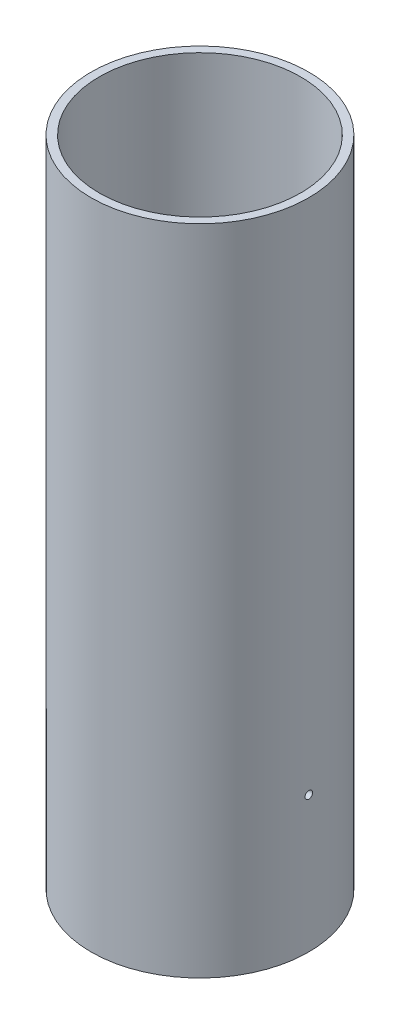
ISO-10303-21;
HEADER;
FILE_DESCRIPTION(('STEP AP214'),'2;1');
FILE_NAME('part.step','',(''),(''),'','','');
FILE_SCHEMA(('AUTOMOTIVE_DESIGN { 1 0 10303 214 1 1 1 1 }'));
ENDSEC;
DATA;
#1=APPLICATION_CONTEXT('core data for automotive mechanical design processes');
#2=APPLICATION_PROTOCOL_DEFINITION('international standard','automotive_design',2000,#1);
#3=PRODUCT_CONTEXT('',#1,'mechanical');
#4=PRODUCT('Part','Part','',(#3));
#5=PRODUCT_RELATED_PRODUCT_CATEGORY('part','',(#4));
#6=PRODUCT_DEFINITION_FORMATION('','',#4);
#7=PRODUCT_DEFINITION_CONTEXT('part definition',#1,'design');
#8=PRODUCT_DEFINITION('design','',#6,#7);
#9=PRODUCT_DEFINITION_SHAPE('','',#8);
#10=(LENGTH_UNIT() NAMED_UNIT(*) SI_UNIT(.MILLI.,.METRE.));
#11=(NAMED_UNIT(*) PLANE_ANGLE_UNIT() SI_UNIT($,.RADIAN.));
#12=(NAMED_UNIT(*) SI_UNIT($,.STERADIAN.) SOLID_ANGLE_UNIT());
#13=UNCERTAINTY_MEASURE_WITH_UNIT(LENGTH_MEASURE(1.E-05),#10,'distance_accuracy_value','');
#14=(GEOMETRIC_REPRESENTATION_CONTEXT(3) GLOBAL_UNCERTAINTY_ASSIGNED_CONTEXT((#13)) GLOBAL_UNIT_ASSIGNED_CONTEXT((#10,
#11,#12)) REPRESENTATION_CONTEXT('',''));
#15=CARTESIAN_POINT('',(0.,0.,0.));
#16=DIRECTION('',(0.,0.,1.));
#17=DIRECTION('',(1.,0.,0.));
#18=AXIS2_PLACEMENT_3D('',#15,#16,#17);
#19=CARTESIAN_POINT('',(0.,304.8,0.));
#20=DIRECTION('',(0.,1.,0.));
#21=DIRECTION('',(0.,0.,1.));
#22=AXIS2_PLACEMENT_3D('',#19,#20,#21);
#23=PLANE('',#22);
#24=CARTESIAN_POINT('',(0.,304.8,0.));
#25=DIRECTION('',(0.,1.,0.));
#26=DIRECTION('',(0.,0.,1.));
#27=AXIS2_PLACEMENT_3D('',#24,#25,#26);
#28=CIRCLE('',#27,50.8);
#29=CARTESIAN_POINT('',(0.,304.8,50.8));
#30=VERTEX_POINT('',#29);
#31=EDGE_CURVE('E10',#30,#30,#28,.T.);
#32=ORIENTED_EDGE('',*,*,#31,.T.);
#33=EDGE_LOOP('',(#32));
#34=FACE_BOUND('',#33,.T.);
#35=CARTESIAN_POINT('',(0.,304.8,0.));
#36=DIRECTION('',(0.,1.,0.));
#37=DIRECTION('',(0.,0.,1.));
#38=AXIS2_PLACEMENT_3D('',#35,#36,#37);
#39=CIRCLE('',#38,46.99);
#40=CARTESIAN_POINT('',(0.,304.8,46.99));
#41=VERTEX_POINT('',#40);
#42=EDGE_CURVE('E47',#41,#41,#39,.T.);
#43=ORIENTED_EDGE('',*,*,#42,.F.);
#44=EDGE_LOOP('',(#43));
#45=FACE_BOUND('',#44,.T.);
#46=ADVANCED_FACE('F36',(#34,#45),#23,.T.);
#47=CARTESIAN_POINT('',(0.,0.,0.));
#48=DIRECTION('',(0.,1.,0.));
#49=DIRECTION('',(0.,0.,1.));
#50=AXIS2_PLACEMENT_3D('',#47,#48,#49);
#51=PLANE('',#50);
#52=CARTESIAN_POINT('',(0.,0.,0.));
#53=DIRECTION('',(0.,1.,0.));
#54=DIRECTION('',(0.,0.,1.));
#55=AXIS2_PLACEMENT_3D('',#52,#53,#54);
#56=CIRCLE('',#55,50.8);
#57=CARTESIAN_POINT('',(0.,0.,50.8));
#58=VERTEX_POINT('',#57);
#59=EDGE_CURVE('E40',#58,#58,#56,.T.);
#60=ORIENTED_EDGE('',*,*,#59,.F.);
#61=EDGE_LOOP('',(#60));
#62=FACE_BOUND('',#61,.T.);
#63=CARTESIAN_POINT('',(0.,0.,0.));
#64=DIRECTION('',(0.,1.,0.));
#65=DIRECTION('',(0.,0.,1.));
#66=AXIS2_PLACEMENT_3D('',#63,#64,#65);
#67=CIRCLE('',#66,46.99);
#68=CARTESIAN_POINT('',(0.,0.,46.99));
#69=VERTEX_POINT('',#68);
#70=EDGE_CURVE('E49',#69,#69,#67,.T.);
#71=ORIENTED_EDGE('',*,*,#70,.T.);
#72=EDGE_LOOP('',(#71));
#73=FACE_BOUND('',#72,.T.);
#74=ADVANCED_FACE('F103',(#62,#73),#51,.F.);
#75=CARTESIAN_POINT('',(0.,304.8,0.));
#76=DIRECTION('',(0.,-1.,0.));
#77=DIRECTION('',(0.,0.,-1.));
#78=AXIS2_PLACEMENT_3D('',#75,#76,#77);
#79=CYLINDRICAL_SURFACE('',#78,50.8);
#80=CARTESIAN_POINT('',(-50.7697586486286,63.5,1.7526));
#81=CARTESIAN_POINT('',(-50.7697590563509,63.5984128763006,1.75259564543798));
#82=CARTESIAN_POINT('',(-50.7700478702747,63.6968963656229,1.7442829792928));
#83=CARTESIAN_POINT('',(-50.7711721845594,63.8911489011766,1.71123866624449));
#84=CARTESIAN_POINT('',(-50.7720083363126,63.9869145710359,1.68648745514487));
#85=CARTESIAN_POINT('',(-50.7741324957904,64.1728892633122,1.62127343591902));
#86=CARTESIAN_POINT('',(-50.7754202807472,64.2631009994601,1.58081837265307));
#87=CARTESIAN_POINT('',(-50.778302314984,64.4354278003749,1.48535627271673));
#88=CARTESIAN_POINT('',(-50.7798964898759,64.5175448231426,1.43035276703111));
#89=CARTESIAN_POINT('',(-50.7832127031895,64.6714220596937,1.30731978963725));
#90=CARTESIAN_POINT('',(-50.7849348021763,64.7431773198127,1.23928412354476));
#91=CARTESIAN_POINT('',(-50.7883122209499,64.8742523072187,1.09212943641575));
#92=CARTESIAN_POINT('',(-50.7899675380634,64.9335715370596,1.01300997223393));
#93=CARTESIAN_POINT('',(-50.7930251641414,65.0381002788022,0.845912742481092));
#94=CARTESIAN_POINT('',(-50.7944274146147,65.0833065305353,0.757932936325513));
#95=CARTESIAN_POINT('',(-50.7968203288866,65.1583049698595,0.575626931287689));
#96=CARTESIAN_POINT('',(-50.7978109946004,65.1880972291829,0.481300761941916));
#97=CARTESIAN_POINT('',(-50.7992687193491,65.2314105480648,0.289019692747186));
#98=CARTESIAN_POINT('',(-50.7997359884024,65.2449381341556,0.191066264685273));
#99=CARTESIAN_POINT('',(-50.8000949541903,65.2553582252076,-0.00572216138148231));
#100=CARTESIAN_POINT('',(-50.7999866536264,65.2522508082501,-0.104557155246264));
#101=CARTESIAN_POINT('',(-50.7992068664176,65.2294945824589,-0.300258946196506));
#102=CARTESIAN_POINT('',(-50.798535619427,65.2098528125245,-0.397126562852689));
#103=CARTESIAN_POINT('',(-50.79670585879,65.1545963334781,-0.586188739561726));
#104=CARTESIAN_POINT('',(-50.7955473438949,65.1189815834397,-0.678383287640433));
#105=CARTESIAN_POINT('',(-50.7928731919409,65.0327820501376,-0.855504921624216));
#106=CARTESIAN_POINT('',(-50.7913574780237,64.9821940444919,-0.940430438089964));
#107=CARTESIAN_POINT('',(-50.7881397227175,64.8674863920499,-1.1005860855059));
#108=CARTESIAN_POINT('',(-50.7864376807411,64.8033667025959,-1.17581618589081));
#109=CARTESIAN_POINT('',(-50.7830380115152,64.6633759732606,-1.31448652938248));
#110=CARTESIAN_POINT('',(-50.7813403870287,64.587498826421,-1.37792060761373));
#111=CARTESIAN_POINT('',(-50.7781418359447,64.4261685812354,-1.49115077723233));
#112=CARTESIAN_POINT('',(-50.7766409093824,64.3407154811742,-1.54094686617709));
#113=CARTESIAN_POINT('',(-50.774005062609,64.1626555204402,-1.62548688040682));
#114=CARTESIAN_POINT('',(-50.7728701473992,64.0700485620369,-1.66023060001523));
#115=CARTESIAN_POINT('',(-50.7710945021759,63.8803112541566,-1.71367563160492));
#116=CARTESIAN_POINT('',(-50.7704537703865,63.7831809209368,-1.73237700123867));
#117=CARTESIAN_POINT('',(-50.7697390631889,63.5872076921852,-1.75319889347759));
#118=CARTESIAN_POINT('',(-50.7696647957442,63.4883657054311,-1.75532795982299));
#119=CARTESIAN_POINT('',(-50.7700906295787,63.2917278161045,-1.74296707929671));
#120=CARTESIAN_POINT('',(-50.7705907299688,63.1939319119131,-1.72847715814734));
#121=CARTESIAN_POINT('',(-50.7721086588272,63.0021861307538,-1.68329669707894));
#122=CARTESIAN_POINT('',(-50.7731263630513,62.908235336662,-1.65261004490692));
#123=CARTESIAN_POINT('',(-50.7755646720241,62.7268185234742,-1.57591114524678));
#124=CARTESIAN_POINT('',(-50.7769852778606,62.6393525218878,-1.52989885637972));
#125=CARTESIAN_POINT('',(-50.7800699634245,62.4733487917968,-1.4238328020931));
#126=CARTESIAN_POINT('',(-50.7817341427782,62.3948147400992,-1.36377328505035));
#127=CARTESIAN_POINT('',(-50.7851180250531,62.2489411481377,-1.23132608217659));
#128=CARTESIAN_POINT('',(-50.7868377281547,62.1816016442255,-1.15893835631414));
#129=CARTESIAN_POINT('',(-50.7901396523595,62.0600001227909,-1.00385294890731));
#130=CARTESIAN_POINT('',(-50.7917218153481,62.005743616193,-0.921150944877369));
#131=CARTESIAN_POINT('',(-50.7945694877666,61.9118859067369,-0.747806598646963));
#132=CARTESIAN_POINT('',(-50.7958349980311,61.8722846652456,-0.657164277378949));
#133=CARTESIAN_POINT('',(-50.797906437117,61.808871284707,-0.470533027739564));
#134=CARTESIAN_POINT('',(-50.7987124696127,61.7850555836892,-0.374545310847077));
#135=CARTESIAN_POINT('',(-50.7997745080026,61.7538776471983,-0.179930892200234));
#136=CARTESIAN_POINT('',(-50.8000305148536,61.7465153831019,-0.0813041950370855));
#137=CARTESIAN_POINT('',(-50.7999636515915,61.7484537094743,0.115733551471459));
#138=CARTESIAN_POINT('',(-50.7996410827598,61.7577456276188,0.214144686350414));
#139=CARTESIAN_POINT('',(-50.7984540004404,61.7927106961027,0.408009205742913));
#140=CARTESIAN_POINT('',(-50.7975894858873,61.8183838786445,0.503462584441698));
#141=CARTESIAN_POINT('',(-50.795415868083,61.8853813160639,0.688704831817098));
#142=CARTESIAN_POINT('',(-50.7941067579118,61.9267058145513,0.778493612299949));
#143=CARTESIAN_POINT('',(-50.7911914024654,62.0238304017296,0.949857530207009));
#144=CARTESIAN_POINT('',(-50.7895851676408,62.0796299813303,1.03143295635577));
#145=CARTESIAN_POINT('',(-50.7862556251448,62.2041484163395,1.18409570495971));
#146=CARTESIAN_POINT('',(-50.7845322692961,62.2728726090218,1.2551786727871));
#147=CARTESIAN_POINT('',(-50.7811628093207,62.4212991590508,1.38481814627635));
#148=CARTESIAN_POINT('',(-50.7795167244055,62.5010042273508,1.44337154950279));
#149=CARTESIAN_POINT('',(-50.776486775378,62.6691668503138,1.54630287522679));
#150=CARTESIAN_POINT('',(-50.7751030967528,62.7576305294356,1.59067078551631));
#151=CARTESIAN_POINT('',(-50.7727572810387,62.9406881204398,1.66387261434695));
#152=CARTESIAN_POINT('',(-50.7717946423914,63.0352745835159,1.69272502498605));
#153=CARTESIAN_POINT('',(-50.7706563408481,63.1920473185674,1.72644481694718));
#154=CARTESIAN_POINT('',(-50.7703211727805,63.2532163791338,1.73624063654641));
#155=CARTESIAN_POINT('',(-50.7698721985096,63.3762476509913,1.74931959604588));
#156=CARTESIAN_POINT('',(-50.7697583922192,63.4381098620097,1.75260273850795));
#157=CARTESIAN_POINT('',(-50.7697586486286,63.5,1.7526));
#158=B_SPLINE_CURVE_WITH_KNOTS('',3,(#80,#81,#82,#83,#84,#85,#86,#87,#88,#89,#90,#91,#92,#93,
#94,#95,#96,#97,#98,#99,#100,#101,#102,#103,#104,#105,#106,#107,#108,#109,#110,#111,#112,#113,
#114,#115,#116,#117,#118,#119,#120,#121,#122,#123,#124,#125,#126,#127,#128,#129,#130,#131,#132,
#133,#134,#135,#136,#137,#138,#139,#140,#141,#142,#143,#144,#145,#146,#147,#148,#149,#150,#151,
#152,#153,#154,#155,#156,#157),.UNSPECIFIED.,.T.,.F.,(4,2,2,2,2,2,2,2,2,2,2,2,2,2,2,2,2,2,2,2,2,
2,2,2,2,2,2,2,2,2,2,2,2,2,2,2,2,2,4),(0.,0.295012718980975,0.59037717556123,0.885596148343644,
1.18074353554532,1.47603156047933,1.77133139480086,2.06669939447319,2.36206601957486,
2.65731408318958,2.9525607609726,3.24768181174947,3.54280361869842,3.8379889848041,
4.13317528147352,4.42851541843867,4.72385560830019,5.0191998335821,5.31454299746121,
5.6097338890545,5.90492432376197,6.20004393527858,6.49516434361926,6.79040580090399,
7.08564821689797,7.3810147808539,7.67638056618115,7.97167968019765,8.26697828049624,
8.56212315476917,8.85726860924117,9.15241865778438,9.44755832727452,9.74282014463667,
10.0381549871587,10.3336978210068,10.6288876279762,10.8144160441254,10.9999443872954),.UNSPECIFIED.);
#159=CARTESIAN_POINT('',(-50.7697586486286,63.5,1.7526));
#160=VERTEX_POINT('',#159);
#161=EDGE_CURVE('E83',#160,#160,#158,.T.);
#162=ORIENTED_EDGE('',*,*,#161,.F.);
#163=EDGE_LOOP('',(#162));
#164=FACE_BOUND('',#163,.T.);
#165=CARTESIAN_POINT('',(50.7697586486286,63.5,-1.7526));
#166=CARTESIAN_POINT('',(50.7697590563509,63.5984128763006,-1.75259564543798));
#167=CARTESIAN_POINT('',(50.7700478702747,63.6968963656229,-1.7442829792928));
#168=CARTESIAN_POINT('',(50.7711721845594,63.8911489011766,-1.71123866624449));
#169=CARTESIAN_POINT('',(50.7720083363126,63.9869145710359,-1.68648745514487));
#170=CARTESIAN_POINT('',(50.7741324957904,64.1728892633122,-1.62127343591902));
#171=CARTESIAN_POINT('',(50.7754202807472,64.2631009994601,-1.58081837265307));
#172=CARTESIAN_POINT('',(50.778302314984,64.4354278003749,-1.48535627271673));
#173=CARTESIAN_POINT('',(50.7798964898759,64.5175448231426,-1.43035276703111));
#174=CARTESIAN_POINT('',(50.7832127031895,64.6714220596937,-1.30731978963725));
#175=CARTESIAN_POINT('',(50.7849348021763,64.7431773198127,-1.23928412354476));
#176=CARTESIAN_POINT('',(50.7883122209499,64.8742523072187,-1.09212943641575));
#177=CARTESIAN_POINT('',(50.7899675380634,64.9335715370596,-1.01300997223393));
#178=CARTESIAN_POINT('',(50.7930251641414,65.0381002788022,-0.845912742481092));
#179=CARTESIAN_POINT('',(50.7944274146147,65.0833065305353,-0.757932936325513));
#180=CARTESIAN_POINT('',(50.7968203288866,65.1583049698595,-0.575626931287689));
#181=CARTESIAN_POINT('',(50.7978109946004,65.1880972291829,-0.481300761941916));
#182=CARTESIAN_POINT('',(50.7992687193491,65.2314105480648,-0.289019692747186));
#183=CARTESIAN_POINT('',(50.7997359884024,65.2449381341556,-0.191066264685273));
#184=CARTESIAN_POINT('',(50.8000949541903,65.2553582252076,0.00572216138148231));
#185=CARTESIAN_POINT('',(50.7999866536264,65.2522508082501,0.104557155246264));
#186=CARTESIAN_POINT('',(50.7992068664176,65.2294945824589,0.300258946196506));
#187=CARTESIAN_POINT('',(50.798535619427,65.2098528125245,0.397126562852689));
#188=CARTESIAN_POINT('',(50.79670585879,65.1545963334781,0.586188739561726));
#189=CARTESIAN_POINT('',(50.7955473438949,65.1189815834397,0.678383287640433));
#190=CARTESIAN_POINT('',(50.7928731919409,65.0327820501376,0.855504921624216));
#191=CARTESIAN_POINT('',(50.7913574780237,64.9821940444919,0.940430438089964));
#192=CARTESIAN_POINT('',(50.7881397227175,64.8674863920499,1.1005860855059));
#193=CARTESIAN_POINT('',(50.7864376807411,64.8033667025959,1.17581618589081));
#194=CARTESIAN_POINT('',(50.7830380115152,64.6633759732606,1.31448652938248));
#195=CARTESIAN_POINT('',(50.7813403870287,64.587498826421,1.37792060761373));
#196=CARTESIAN_POINT('',(50.7781418359447,64.4261685812354,1.49115077723233));
#197=CARTESIAN_POINT('',(50.7766409093824,64.3407154811742,1.54094686617709));
#198=CARTESIAN_POINT('',(50.774005062609,64.1626555204402,1.62548688040682));
#199=CARTESIAN_POINT('',(50.7728701473992,64.0700485620369,1.66023060001523));
#200=CARTESIAN_POINT('',(50.7710945021759,63.8803112541566,1.71367563160492));
#201=CARTESIAN_POINT('',(50.7704537703865,63.7831809209368,1.73237700123867));
#202=CARTESIAN_POINT('',(50.7697390631889,63.5872076921852,1.75319889347759));
#203=CARTESIAN_POINT('',(50.7696647957442,63.4883657054311,1.75532795982299));
#204=CARTESIAN_POINT('',(50.7700906295787,63.2917278161045,1.74296707929671));
#205=CARTESIAN_POINT('',(50.7705907299688,63.1939319119131,1.72847715814734));
#206=CARTESIAN_POINT('',(50.7721086588272,63.0021861307538,1.68329669707894));
#207=CARTESIAN_POINT('',(50.7731263630513,62.908235336662,1.65261004490692));
#208=CARTESIAN_POINT('',(50.7755646720241,62.7268185234742,1.57591114524678));
#209=CARTESIAN_POINT('',(50.7769852778606,62.6393525218878,1.52989885637972));
#210=CARTESIAN_POINT('',(50.7800699634245,62.4733487917968,1.4238328020931));
#211=CARTESIAN_POINT('',(50.7817341427782,62.3948147400992,1.36377328505035));
#212=CARTESIAN_POINT('',(50.7851180250531,62.2489411481377,1.23132608217659));
#213=CARTESIAN_POINT('',(50.7868377281547,62.1816016442255,1.15893835631414));
#214=CARTESIAN_POINT('',(50.7901396523595,62.0600001227909,1.00385294890731));
#215=CARTESIAN_POINT('',(50.7917218153481,62.005743616193,0.921150944877369));
#216=CARTESIAN_POINT('',(50.7945694877666,61.9118859067369,0.747806598646963));
#217=CARTESIAN_POINT('',(50.7958349980311,61.8722846652456,0.657164277378949));
#218=CARTESIAN_POINT('',(50.797906437117,61.808871284707,0.470533027739564));
#219=CARTESIAN_POINT('',(50.7987124696127,61.7850555836892,0.374545310847077));
#220=CARTESIAN_POINT('',(50.7997745080026,61.7538776471983,0.179930892200234));
#221=CARTESIAN_POINT('',(50.8000305148536,61.7465153831019,0.0813041950370855));
#222=CARTESIAN_POINT('',(50.7999636515915,61.7484537094743,-0.115733551471459));
#223=CARTESIAN_POINT('',(50.7996410827598,61.7577456276188,-0.214144686350414));
#224=CARTESIAN_POINT('',(50.7984540004404,61.7927106961027,-0.408009205742913));
#225=CARTESIAN_POINT('',(50.7975894858873,61.8183838786445,-0.503462584441698));
#226=CARTESIAN_POINT('',(50.795415868083,61.8853813160639,-0.688704831817098));
#227=CARTESIAN_POINT('',(50.7941067579118,61.9267058145513,-0.778493612299949));
#228=CARTESIAN_POINT('',(50.7911914024654,62.0238304017296,-0.949857530207009));
#229=CARTESIAN_POINT('',(50.7895851676408,62.0796299813303,-1.03143295635577));
#230=CARTESIAN_POINT('',(50.7862556251448,62.2041484163395,-1.18409570495971));
#231=CARTESIAN_POINT('',(50.7845322692961,62.2728726090218,-1.2551786727871));
#232=CARTESIAN_POINT('',(50.7811628093207,62.4212991590508,-1.38481814627635));
#233=CARTESIAN_POINT('',(50.7795167244055,62.5010042273508,-1.44337154950279));
#234=CARTESIAN_POINT('',(50.776486775378,62.6691668503138,-1.54630287522679));
#235=CARTESIAN_POINT('',(50.7751030967528,62.7576305294356,-1.59067078551631));
#236=CARTESIAN_POINT('',(50.7727572810387,62.9406881204398,-1.66387261434695));
#237=CARTESIAN_POINT('',(50.7717946423914,63.0352745835159,-1.69272502498605));
#238=CARTESIAN_POINT('',(50.7706563408481,63.1920473185674,-1.72644481694718));
#239=CARTESIAN_POINT('',(50.7703211727805,63.2532163791338,-1.73624063654641));
#240=CARTESIAN_POINT('',(50.7698721985096,63.3762476509913,-1.74931959604588));
#241=CARTESIAN_POINT('',(50.7697583922192,63.4381098620097,-1.75260273850795));
#242=CARTESIAN_POINT('',(50.7697586486286,63.5,-1.7526));
#243=B_SPLINE_CURVE_WITH_KNOTS('',3,(#165,#166,#167,#168,#169,#170,#171,#172,#173,#174,#175,
#176,#177,#178,#179,#180,#181,#182,#183,#184,#185,#186,#187,#188,#189,#190,#191,#192,#193,#194,
#195,#196,#197,#198,#199,#200,#201,#202,#203,#204,#205,#206,#207,#208,#209,#210,#211,#212,#213,
#214,#215,#216,#217,#218,#219,#220,#221,#222,#223,#224,#225,#226,#227,#228,#229,#230,#231,#232,
#233,#234,#235,#236,#237,#238,#239,#240,#241,#242),.UNSPECIFIED.,.T.,.F.,(4,2,2,2,2,2,2,2,2,2,2,
2,2,2,2,2,2,2,2,2,2,2,2,2,2,2,2,2,2,2,2,2,2,2,2,2,2,2,4),(0.,0.295012718980975,0.59037717556123,
0.885596148343644,1.18074353554532,1.47603156047933,1.77133139480086,2.06669939447319,
2.36206601957486,2.65731408318958,2.9525607609726,3.24768181174947,3.54280361869842,
3.8379889848041,4.13317528147352,4.42851541843867,4.72385560830019,5.0191998335821,
5.31454299746121,5.6097338890545,5.90492432376197,6.20004393527858,6.49516434361926,
6.79040580090399,7.08564821689797,7.3810147808539,7.67638056618115,7.97167968019765,
8.26697828049624,8.56212315476917,8.85726860924117,9.15241865778438,9.44755832727452,
9.74282014463667,10.0381549871587,10.3336978210068,10.6288876279762,10.8144160441254,
10.9999443872954),.UNSPECIFIED.);
#244=CARTESIAN_POINT('',(50.7697586486286,63.5,-1.7526));
#245=VERTEX_POINT('',#244);
#246=EDGE_CURVE('E62',#245,#245,#243,.T.);
#247=ORIENTED_EDGE('',*,*,#246,.F.);
#248=EDGE_LOOP('',(#247));
#249=FACE_BOUND('',#248,.T.);
#250=ORIENTED_EDGE('',*,*,#31,.F.);
#251=EDGE_LOOP('',(#250));
#252=FACE_BOUND('',#251,.T.);
#253=ORIENTED_EDGE('',*,*,#59,.T.);
#254=EDGE_LOOP('',(#253));
#255=FACE_BOUND('',#254,.T.);
#256=ADVANCED_FACE('F38',(#164,#249,#252,#255),#79,.T.);
#257=CARTESIAN_POINT('',(0.,304.8,0.));
#258=DIRECTION('',(0.,-1.,0.));
#259=DIRECTION('',(0.,0.,-1.));
#260=AXIS2_PLACEMENT_3D('',#257,#258,#259);
#261=CYLINDRICAL_SURFACE('',#260,46.99);
#262=CARTESIAN_POINT('',(-46.957305004014,63.5,1.7526));
#263=CARTESIAN_POINT('',(-46.9573054445759,63.5984075710603,1.75259564734134));
#264=CARTESIAN_POINT('',(-46.9576176740396,63.6968856254646,1.74428387382596));
#265=CARTESIAN_POINT('',(-46.9588331315927,63.8911270768496,1.71124331321613));
#266=CARTESIAN_POINT('',(-46.9597370626678,63.9868871032365,1.68649499777305));
#267=CARTESIAN_POINT('',(-46.9620333860425,64.1728504796217,1.62128912238347));
#268=CARTESIAN_POINT('',(-46.9634255362667,64.263056557444,1.58083934668803));
#269=CARTESIAN_POINT('',(-46.9665411223147,64.4353731630258,1.4853901822934));
#270=CARTESIAN_POINT('',(-46.9682644780615,64.5174856403678,1.43039430926523));
#271=CARTESIAN_POINT('',(-46.9718495365507,64.6713606611542,1.3073746566177));
#272=CARTESIAN_POINT('',(-46.9737113133971,64.7431175994072,1.23934386755275));
#273=CARTESIAN_POINT('',(-46.9773627066697,64.8741971610962,1.09219864427939));
#274=CARTESIAN_POINT('',(-46.9791523201979,64.9335192855885,1.01308376553706));
#275=CARTESIAN_POINT('',(-46.9824581413836,65.0380573295969,0.845991128259834));
#276=CARTESIAN_POINT('',(-46.9839742742707,65.083269393842,0.758010956145035));
#277=CARTESIAN_POINT('',(-46.9865615816525,65.1582790150779,0.575702263640206));
#278=CARTESIAN_POINT('',(-46.9876327584167,65.188076650685,0.481373775630455));
#279=CARTESIAN_POINT('',(-46.9892089685648,65.2313981647681,0.289092984605431));
#280=CARTESIAN_POINT('',(-46.989714267454,65.2449296753952,0.191142403350631));
#281=CARTESIAN_POINT('',(-46.9901026577812,65.2553583614198,-0.00564119222074543));
#282=CARTESIAN_POINT('',(-46.9899857524429,65.2522556230026,-0.104474201962642));
#283=CARTESIAN_POINT('',(-46.9891431365899,65.2295102772591,-0.300165462567626));
#284=CARTESIAN_POINT('',(-46.9884177288907,65.2098758967287,-0.397024671121466));
#285=CARTESIAN_POINT('',(-46.9864401979212,65.1546373523605,-0.586071273689249));
#286=CARTESIAN_POINT('',(-46.9851880731688,65.119033143582,-0.678258654555427));
#287=CARTESIAN_POINT('',(-46.98229768311,65.0328561932947,-0.855371238447581));
#288=CARTESIAN_POINT('',(-46.9806593207359,64.9822796881857,-0.94029460858582));
#289=CARTESIAN_POINT('',(-46.9771810537156,64.8675966013989,-1.10044843600946));
#290=CARTESIAN_POINT('',(-46.9753411483133,64.8034899689526,-1.17567885692285));
#291=CARTESIAN_POINT('',(-46.9716657775958,64.6635198332685,-1.31435923099478));
#292=CARTESIAN_POINT('',(-46.9698303156676,64.5876491929634,-1.37780198102301));
#293=CARTESIAN_POINT('',(-46.9663718890091,64.4263298705122,-1.49105064187032));
#294=CARTESIAN_POINT('',(-46.9647489243192,64.3408811865453,-1.54085655009691));
#295=CARTESIAN_POINT('',(-46.9618985826364,64.1628272079172,-1.62541698584783));
#296=CARTESIAN_POINT('',(-46.960671212084,64.0702217967715,-1.66017126832761));
#297=CARTESIAN_POINT('',(-46.9587507214392,63.8804849683116,-1.71363721568953));
#298=CARTESIAN_POINT('',(-46.9580575991059,63.7833535699834,-1.73234894786158));
#299=CARTESIAN_POINT('',(-46.9572841709909,63.5873846671555,-1.75318977707272));
#300=CARTESIAN_POINT('',(-46.9572034962074,63.4885482259374,-1.75532885920371));
#301=CARTESIAN_POINT('',(-46.9576630972995,63.2919197695292,-1.74298969961645));
#302=CARTESIAN_POINT('',(-46.9582033720466,63.1941277524416,-1.72851148809323));
#303=CARTESIAN_POINT('',(-46.9598436340296,63.0023920217724,-1.68335699816146));
#304=CARTESIAN_POINT('',(-46.9609434641176,62.9084472357182,-1.65268526751554));
#305=CARTESIAN_POINT('',(-46.9635787264831,62.727039752182,-1.5760190050698));
#306=CARTESIAN_POINT('',(-46.9651141601438,62.6395770752832,-1.53002442461636));
#307=CARTESIAN_POINT('',(-46.9684484504826,62.4735705785382,-1.42399237729059));
#308=CARTESIAN_POINT('',(-46.9702474330599,62.3950310533588,-1.36394819059292));
#309=CARTESIAN_POINT('',(-46.9739055869977,62.2491434675025,-1.23153121634546));
#310=CARTESIAN_POINT('',(-46.9757647585827,62.181795448553,-1.15915838283044));
#311=CARTESIAN_POINT('',(-46.9793347928438,62.0601692415642,-1.00409571036348));
#312=CARTESIAN_POINT('',(-46.9810455821583,62.005897495248,-0.921400816813845));
#313=CARTESIAN_POINT('',(-46.9841249694177,61.9120084400935,-0.748067127351942));
#314=CARTESIAN_POINT('',(-46.9854935683552,61.8723910887449,-0.657428354484697));
#315=CARTESIAN_POINT('',(-46.9877339582495,61.8089467104141,-0.470803996318473));
#316=CARTESIAN_POINT('',(-46.988605879983,61.7851155266141,-0.374819825793508));
#317=CARTESIAN_POINT('',(-46.9897551538534,61.7539063391458,-0.180209357503722));
#318=CARTESIAN_POINT('',(-46.9900325073802,61.7465282970149,-0.0815830659159371));
#319=CARTESIAN_POINT('',(-46.9899613912247,61.748435294875,0.115447816692714));
#320=CARTESIAN_POINT('',(-46.9896133020076,61.7577102046502,0.213852506059867));
#321=CARTESIAN_POINT('',(-46.9883312590676,61.7926389486572,0.407706884435431));
#322=CARTESIAN_POINT('',(-46.987397304199,61.8182928149164,0.503156567665221));
#323=CARTESIAN_POINT('',(-46.9850486900038,61.8852495146225,0.688394466434001));
#324=CARTESIAN_POINT('',(-46.9836340236426,61.9265525770793,0.778182599099609));
#325=CARTESIAN_POINT('',(-46.9804832919601,62.0236326849702,0.949549181067063));
#326=CARTESIAN_POINT('',(-46.9787472377216,62.0794092313311,1.03112791331001));
#327=CARTESIAN_POINT('',(-46.975148134146,62.2038864089897,1.18380875960701));
#328=CARTESIAN_POINT('',(-46.9732850215984,62.2725935035006,1.25490560255566));
#329=CARTESIAN_POINT('',(-46.9696420004811,62.4209883842887,1.38457588657947));
#330=CARTESIAN_POINT('',(-46.9678621125869,62.5006788799409,1.44314622850413));
#331=CARTESIAN_POINT('',(-46.9645854770157,62.6688192188269,1.54611619579722));
#332=CARTESIAN_POINT('',(-46.9630889407041,62.7572755265514,1.59050525951333));
#333=CARTESIAN_POINT('',(-46.9605514392459,62.940323132884,1.6637500818643));
#334=CARTESIAN_POINT('',(-46.9595099326972,63.0349069860528,1.69262430977033));
#335=CARTESIAN_POINT('',(-46.9582775342668,63.191737784543,1.72639182075284));
#336=CARTESIAN_POINT('',(-46.9579144271941,63.2529674015776,1.73620746618684));
#337=CARTESIAN_POINT('',(-46.9574280234443,63.3761220341865,1.74931292442031));
#338=CARTESIAN_POINT('',(-46.9573047266563,63.4380470494392,1.75260274023679));
#339=CARTESIAN_POINT('',(-46.957305004014,63.5,1.7526));
#340=B_SPLINE_CURVE_WITH_KNOTS('',3,(#262,#263,#264,#265,#266,#267,#268,#269,#270,#271,#272,
#273,#274,#275,#276,#277,#278,#279,#280,#281,#282,#283,#284,#285,#286,#287,#288,#289,#290,#291,
#292,#293,#294,#295,#296,#297,#298,#299,#300,#301,#302,#303,#304,#305,#306,#307,#308,#309,#310,
#311,#312,#313,#314,#315,#316,#317,#318,#319,#320,#321,#322,#323,#324,#325,#326,#327,#328,#329,
#330,#331,#332,#333,#334,#335,#336,#337,#338,#339),.UNSPECIFIED.,.T.,.F.,(4,2,2,2,2,2,2,2,2,2,2,
2,2,2,2,2,2,2,2,2,2,2,2,2,2,2,2,2,2,2,2,2,2,2,2,2,2,2,4),(0.,0.294996572046742,
0.590344259687846,0.885545710595377,1.18067587885549,1.47596519922764,1.77126636574292,
2.06664814646542,2.36202842067503,2.65727004674842,2.95251014311984,3.24760340317263,
3.54269749365019,3.83786582528261,4.13303526447812,4.42838448483247,4.72373376133529,
5.01908784602364,5.31444069185338,5.60961557249212,5.9047899167739,6.19988140881387,
6.4949738378467,6.79020769701032,7.08544265692631,7.38082276150066,7.67620200921197,
7.97150344662986,8.26680419372046,8.56192536623409,8.85704711583125,9.1521731843976,
9.44728907780993,9.74255287580818,10.0378896399993,10.3334458492706,10.628649436709,
10.8143660060339,11.0000824894986),.UNSPECIFIED.);
#341=CARTESIAN_POINT('',(-46.957305004014,63.5,1.7526));
#342=VERTEX_POINT('',#341);
#343=EDGE_CURVE('E87',#342,#342,#340,.T.);
#344=ORIENTED_EDGE('',*,*,#343,.T.);
#345=EDGE_LOOP('',(#344));
#346=FACE_BOUND('',#345,.T.);
#347=CARTESIAN_POINT('',(46.957305004014,63.5,-1.7526));
#348=CARTESIAN_POINT('',(46.9573054445759,63.5984075710603,-1.75259564734134));
#349=CARTESIAN_POINT('',(46.9576176740396,63.6968856254646,-1.74428387382596));
#350=CARTESIAN_POINT('',(46.9588331315927,63.8911270768496,-1.71124331321613));
#351=CARTESIAN_POINT('',(46.9597370626678,63.9868871032365,-1.68649499777305));
#352=CARTESIAN_POINT('',(46.9620333860425,64.1728504796217,-1.62128912238347));
#353=CARTESIAN_POINT('',(46.9634255362667,64.263056557444,-1.58083934668803));
#354=CARTESIAN_POINT('',(46.9665411223147,64.4353731630258,-1.4853901822934));
#355=CARTESIAN_POINT('',(46.9682644780615,64.5174856403678,-1.43039430926523));
#356=CARTESIAN_POINT('',(46.9718495365507,64.6713606611542,-1.3073746566177));
#357=CARTESIAN_POINT('',(46.9737113133971,64.7431175994072,-1.23934386755275));
#358=CARTESIAN_POINT('',(46.9773627066697,64.8741971610962,-1.09219864427939));
#359=CARTESIAN_POINT('',(46.9791523201979,64.9335192855885,-1.01308376553706));
#360=CARTESIAN_POINT('',(46.9824581413836,65.0380573295969,-0.845991128259834));
#361=CARTESIAN_POINT('',(46.9839742742707,65.083269393842,-0.758010956145035));
#362=CARTESIAN_POINT('',(46.9865615816525,65.1582790150779,-0.575702263640206));
#363=CARTESIAN_POINT('',(46.9876327584167,65.188076650685,-0.481373775630455));
#364=CARTESIAN_POINT('',(46.9892089685648,65.2313981647681,-0.289092984605431));
#365=CARTESIAN_POINT('',(46.989714267454,65.2449296753952,-0.191142403350631));
#366=CARTESIAN_POINT('',(46.9901026577812,65.2553583614198,0.00564119222074543));
#367=CARTESIAN_POINT('',(46.9899857524429,65.2522556230026,0.104474201962642));
#368=CARTESIAN_POINT('',(46.9891431365899,65.2295102772591,0.300165462567626));
#369=CARTESIAN_POINT('',(46.9884177288907,65.2098758967287,0.397024671121466));
#370=CARTESIAN_POINT('',(46.9864401979212,65.1546373523605,0.586071273689249));
#371=CARTESIAN_POINT('',(46.9851880731688,65.119033143582,0.678258654555427));
#372=CARTESIAN_POINT('',(46.98229768311,65.0328561932947,0.855371238447581));
#373=CARTESIAN_POINT('',(46.9806593207359,64.9822796881857,0.94029460858582));
#374=CARTESIAN_POINT('',(46.9771810537156,64.8675966013989,1.10044843600946));
#375=CARTESIAN_POINT('',(46.9753411483133,64.8034899689526,1.17567885692285));
#376=CARTESIAN_POINT('',(46.9716657775958,64.6635198332685,1.31435923099478));
#377=CARTESIAN_POINT('',(46.9698303156676,64.5876491929634,1.37780198102301));
#378=CARTESIAN_POINT('',(46.9663718890091,64.4263298705122,1.49105064187032));
#379=CARTESIAN_POINT('',(46.9647489243192,64.3408811865453,1.54085655009691));
#380=CARTESIAN_POINT('',(46.9618985826364,64.1628272079172,1.62541698584783));
#381=CARTESIAN_POINT('',(46.960671212084,64.0702217967715,1.66017126832761));
#382=CARTESIAN_POINT('',(46.9587507214392,63.8804849683116,1.71363721568953));
#383=CARTESIAN_POINT('',(46.9580575991059,63.7833535699834,1.73234894786158));
#384=CARTESIAN_POINT('',(46.9572841709909,63.5873846671555,1.75318977707272));
#385=CARTESIAN_POINT('',(46.9572034962074,63.4885482259374,1.75532885920371));
#386=CARTESIAN_POINT('',(46.9576630972995,63.2919197695292,1.74298969961645));
#387=CARTESIAN_POINT('',(46.9582033720466,63.1941277524416,1.72851148809323));
#388=CARTESIAN_POINT('',(46.9598436340296,63.0023920217724,1.68335699816146));
#389=CARTESIAN_POINT('',(46.9609434641176,62.9084472357182,1.65268526751554));
#390=CARTESIAN_POINT('',(46.9635787264831,62.727039752182,1.5760190050698));
#391=CARTESIAN_POINT('',(46.9651141601438,62.6395770752832,1.53002442461636));
#392=CARTESIAN_POINT('',(46.9684484504826,62.4735705785382,1.42399237729059));
#393=CARTESIAN_POINT('',(46.9702474330599,62.3950310533588,1.36394819059292));
#394=CARTESIAN_POINT('',(46.9739055869977,62.2491434675025,1.23153121634546));
#395=CARTESIAN_POINT('',(46.9757647585827,62.181795448553,1.15915838283044));
#396=CARTESIAN_POINT('',(46.9793347928438,62.0601692415642,1.00409571036348));
#397=CARTESIAN_POINT('',(46.9810455821583,62.005897495248,0.921400816813845));
#398=CARTESIAN_POINT('',(46.9841249694177,61.9120084400935,0.748067127351942));
#399=CARTESIAN_POINT('',(46.9854935683552,61.8723910887449,0.657428354484697));
#400=CARTESIAN_POINT('',(46.9877339582495,61.8089467104141,0.470803996318473));
#401=CARTESIAN_POINT('',(46.988605879983,61.7851155266141,0.374819825793508));
#402=CARTESIAN_POINT('',(46.9897551538534,61.7539063391458,0.180209357503722));
#403=CARTESIAN_POINT('',(46.9900325073802,61.7465282970149,0.0815830659159371));
#404=CARTESIAN_POINT('',(46.9899613912247,61.748435294875,-0.115447816692714));
#405=CARTESIAN_POINT('',(46.9896133020076,61.7577102046502,-0.213852506059867));
#406=CARTESIAN_POINT('',(46.9883312590676,61.7926389486572,-0.407706884435431));
#407=CARTESIAN_POINT('',(46.987397304199,61.8182928149164,-0.503156567665221));
#408=CARTESIAN_POINT('',(46.9850486900038,61.8852495146225,-0.688394466434001));
#409=CARTESIAN_POINT('',(46.9836340236426,61.9265525770793,-0.778182599099609));
#410=CARTESIAN_POINT('',(46.9804832919601,62.0236326849702,-0.949549181067063));
#411=CARTESIAN_POINT('',(46.9787472377216,62.0794092313311,-1.03112791331001));
#412=CARTESIAN_POINT('',(46.975148134146,62.2038864089897,-1.18380875960701));
#413=CARTESIAN_POINT('',(46.9732850215984,62.2725935035006,-1.25490560255566));
#414=CARTESIAN_POINT('',(46.9696420004811,62.4209883842887,-1.38457588657947));
#415=CARTESIAN_POINT('',(46.9678621125869,62.5006788799409,-1.44314622850413));
#416=CARTESIAN_POINT('',(46.9645854770157,62.6688192188269,-1.54611619579722));
#417=CARTESIAN_POINT('',(46.9630889407041,62.7572755265514,-1.59050525951333));
#418=CARTESIAN_POINT('',(46.9605514392459,62.940323132884,-1.6637500818643));
#419=CARTESIAN_POINT('',(46.9595099326972,63.0349069860528,-1.69262430977033));
#420=CARTESIAN_POINT('',(46.9582775342668,63.191737784543,-1.72639182075284));
#421=CARTESIAN_POINT('',(46.9579144271941,63.2529674015776,-1.73620746618684));
#422=CARTESIAN_POINT('',(46.9574280234443,63.3761220341865,-1.74931292442031));
#423=CARTESIAN_POINT('',(46.9573047266563,63.4380470494392,-1.75260274023679));
#424=CARTESIAN_POINT('',(46.957305004014,63.5,-1.7526));
#425=B_SPLINE_CURVE_WITH_KNOTS('',3,(#347,#348,#349,#350,#351,#352,#353,#354,#355,#356,#357,
#358,#359,#360,#361,#362,#363,#364,#365,#366,#367,#368,#369,#370,#371,#372,#373,#374,#375,#376,
#377,#378,#379,#380,#381,#382,#383,#384,#385,#386,#387,#388,#389,#390,#391,#392,#393,#394,#395,
#396,#397,#398,#399,#400,#401,#402,#403,#404,#405,#406,#407,#408,#409,#410,#411,#412,#413,#414,
#415,#416,#417,#418,#419,#420,#421,#422,#423,#424),.UNSPECIFIED.,.T.,.F.,(4,2,2,2,2,2,2,2,2,2,2,
2,2,2,2,2,2,2,2,2,2,2,2,2,2,2,2,2,2,2,2,2,2,2,2,2,2,2,4),(0.,0.294996572046742,
0.590344259687846,0.885545710595377,1.18067587885549,1.47596519922764,1.77126636574292,
2.06664814646542,2.36202842067503,2.65727004674842,2.95251014311984,3.24760340317263,
3.54269749365019,3.83786582528261,4.13303526447812,4.42838448483247,4.72373376133529,
5.01908784602364,5.31444069185338,5.60961557249212,5.9047899167739,6.19988140881387,
6.4949738378467,6.79020769701032,7.08544265692631,7.38082276150066,7.67620200921197,
7.97150344662986,8.26680419372046,8.56192536623409,8.85704711583125,9.1521731843976,
9.44728907780993,9.74255287580818,10.0378896399993,10.3334458492706,10.628649436709,
10.8143660060339,11.0000824894986),.UNSPECIFIED.);
#426=CARTESIAN_POINT('',(46.957305004014,63.5,-1.7526));
#427=VERTEX_POINT('',#426);
#428=EDGE_CURVE('E52',#427,#427,#425,.T.);
#429=ORIENTED_EDGE('',*,*,#428,.T.);
#430=EDGE_LOOP('',(#429));
#431=FACE_BOUND('',#430,.T.);
#432=ORIENTED_EDGE('',*,*,#42,.T.);
#433=EDGE_LOOP('',(#432));
#434=FACE_BOUND('',#433,.T.);
#435=ORIENTED_EDGE('',*,*,#70,.F.);
#436=EDGE_LOOP('',(#435));
#437=FACE_BOUND('',#436,.T.);
#438=ADVANCED_FACE('F102',(#346,#431,#434,#437),#261,.F.);
#439=CARTESIAN_POINT('',(-50.801,63.5,0.));
#440=DIRECTION('',(1.,0.,0.));
#441=DIRECTION('',(0.,0.,-1.));
#442=AXIS2_PLACEMENT_3D('',#439,#440,#441);
#443=CYLINDRICAL_SURFACE('',#442,1.7526);
#444=ORIENTED_EDGE('',*,*,#428,.F.);
#445=EDGE_LOOP('',(#444));
#446=FACE_BOUND('',#445,.T.);
#447=ORIENTED_EDGE('',*,*,#246,.T.);
#448=EDGE_LOOP('',(#447));
#449=FACE_BOUND('',#448,.T.);
#450=ADVANCED_FACE('F68',(#446,#449),#443,.F.);
#451=CARTESIAN_POINT('',(50.801,63.5,0.));
#452=DIRECTION('',(-1.,0.,0.));
#453=DIRECTION('',(0.,0.,1.));
#454=AXIS2_PLACEMENT_3D('',#451,#452,#453);
#455=CYLINDRICAL_SURFACE('',#454,1.7526);
#456=ORIENTED_EDGE('',*,*,#343,.F.);
#457=EDGE_LOOP('',(#456));
#458=FACE_BOUND('',#457,.T.);
#459=ORIENTED_EDGE('',*,*,#161,.T.);
#460=EDGE_LOOP('',(#459));
#461=FACE_BOUND('',#460,.T.);
#462=ADVANCED_FACE('F73',(#458,#461),#455,.F.);
#463=CLOSED_SHELL('',(#46,#74,#256,#438,#450,#462));
#464=MANIFOLD_SOLID_BREP('B2',#463);
#465=ADVANCED_BREP_SHAPE_REPRESENTATION('',(#18,#464),#14);
#466=SHAPE_DEFINITION_REPRESENTATION(#9,#465);
ENDSEC;
END-ISO-10303-21;
